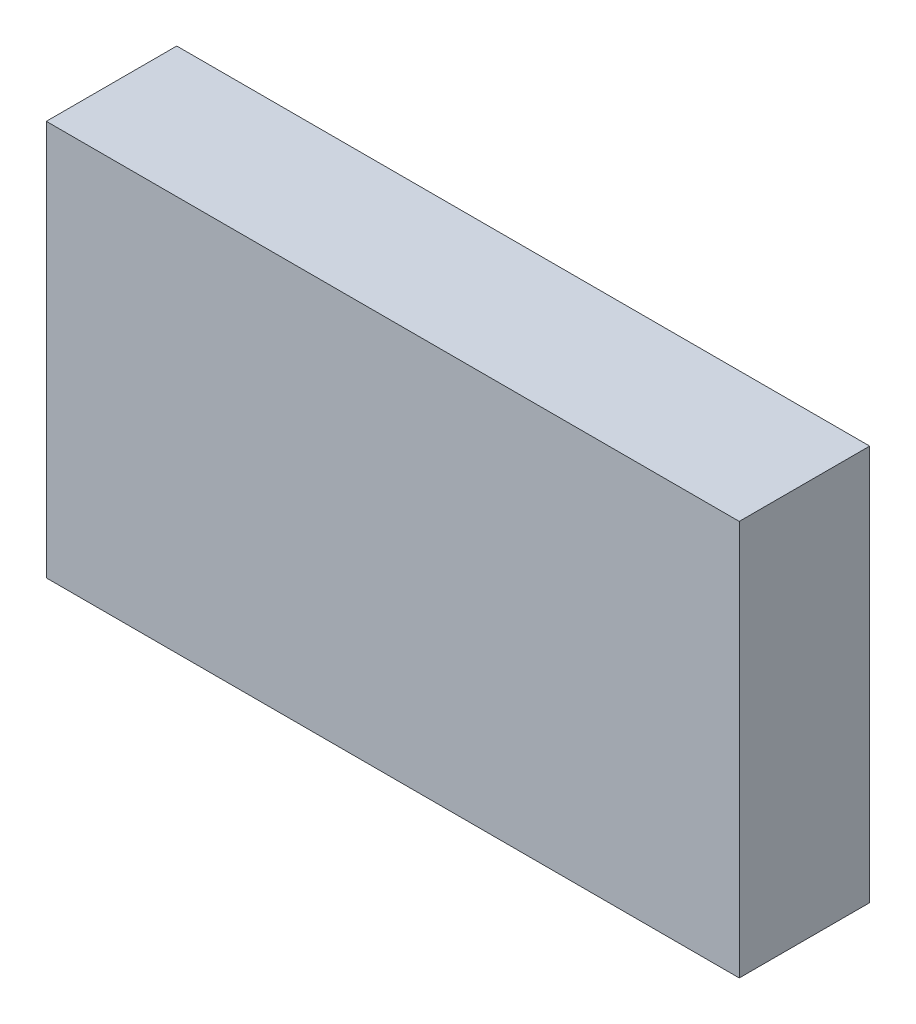
ISO-10303-21;
HEADER;
FILE_DESCRIPTION(('STEP AP214'),'2;1');
FILE_NAME('part.step','',(''),(''),'','','');
FILE_SCHEMA(('AUTOMOTIVE_DESIGN { 1 0 10303 214 1 1 1 1 }'));
ENDSEC;
DATA;
#1=APPLICATION_CONTEXT('core data for automotive mechanical design processes');
#2=APPLICATION_PROTOCOL_DEFINITION('international standard','automotive_design',2000,#1);
#3=PRODUCT_CONTEXT('',#1,'mechanical');
#4=PRODUCT('Part','Part','',(#3));
#5=PRODUCT_RELATED_PRODUCT_CATEGORY('part','',(#4));
#6=PRODUCT_DEFINITION_FORMATION('','',#4);
#7=PRODUCT_DEFINITION_CONTEXT('part definition',#1,'design');
#8=PRODUCT_DEFINITION('design','',#6,#7);
#9=PRODUCT_DEFINITION_SHAPE('','',#8);
#10=(LENGTH_UNIT() NAMED_UNIT(*) SI_UNIT(.MILLI.,.METRE.));
#11=(NAMED_UNIT(*) PLANE_ANGLE_UNIT() SI_UNIT($,.RADIAN.));
#12=(NAMED_UNIT(*) SI_UNIT($,.STERADIAN.) SOLID_ANGLE_UNIT());
#13=UNCERTAINTY_MEASURE_WITH_UNIT(LENGTH_MEASURE(1.E-05),#10,'distance_accuracy_value','');
#14=(GEOMETRIC_REPRESENTATION_CONTEXT(3) GLOBAL_UNCERTAINTY_ASSIGNED_CONTEXT((#13)) GLOBAL_UNIT_ASSIGNED_CONTEXT((#10,
#11,#12)) REPRESENTATION_CONTEXT('',''));
#15=CARTESIAN_POINT('',(0.,0.,0.));
#16=DIRECTION('',(0.,0.,1.));
#17=DIRECTION('',(1.,0.,0.));
#18=AXIS2_PLACEMENT_3D('',#15,#16,#17);
#19=CARTESIAN_POINT('',(-54.5683161798166,42.0089418209699,20.));
#20=DIRECTION('',(1.,0.,0.));
#21=DIRECTION('',(0.,0.,-1.));
#22=AXIS2_PLACEMENT_3D('',#19,#20,#21);
#23=PLANE('',#22);
#24=DIRECTION('',(0.,-1.,0.));
#25=VECTOR('',#24,1.);
#26=CARTESIAN_POINT('',(-54.5683161798166,42.0089418209699,0.));
#27=LINE('',#26,#25);
#28=CARTESIAN_POINT('',(-54.5683161798166,42.0089418209699,0.));
#29=VERTEX_POINT('',#28);
#30=CARTESIAN_POINT('',(-54.5683161798166,-18.6225206010485,0.));
#31=VERTEX_POINT('',#30);
#32=EDGE_CURVE('E96',#29,#31,#27,.T.);
#33=ORIENTED_EDGE('',*,*,#32,.T.);
#34=DIRECTION('',(0.,0.,-1.));
#35=VECTOR('',#34,1.);
#36=CARTESIAN_POINT('',(-54.5683161798166,-18.6225206010485,20.));
#37=LINE('',#36,#35);
#38=CARTESIAN_POINT('',(-54.5683161798166,-18.6225206010485,20.));
#39=VERTEX_POINT('',#38);
#40=EDGE_CURVE('E11',#39,#31,#37,.T.);
#41=ORIENTED_EDGE('',*,*,#40,.F.);
#42=DIRECTION('',(0.,-1.,0.));
#43=VECTOR('',#42,1.);
#44=CARTESIAN_POINT('',(-54.5683161798166,42.0089418209699,20.));
#45=LINE('',#44,#43);
#46=CARTESIAN_POINT('',(-54.5683161798166,42.0089418209699,20.));
#47=VERTEX_POINT('',#46);
#48=EDGE_CURVE('E84',#47,#39,#45,.T.);
#49=ORIENTED_EDGE('',*,*,#48,.F.);
#50=DIRECTION('',(0.,0.,-1.));
#51=VECTOR('',#50,1.);
#52=CARTESIAN_POINT('',(-54.5683161798166,42.0089418209699,20.));
#53=LINE('',#52,#51);
#54=EDGE_CURVE('E92',#47,#29,#53,.T.);
#55=ORIENTED_EDGE('',*,*,#54,.T.);
#56=EDGE_LOOP('',(#33,#41,#49,#55));
#57=FACE_BOUND('',#56,.T.);
#58=ADVANCED_FACE('F33',(#57),#23,.F.);
#59=CARTESIAN_POINT('',(-54.5683161798166,-18.6225206010485,20.));
#60=DIRECTION('',(0.,1.,0.));
#61=DIRECTION('',(0.,0.,1.));
#62=AXIS2_PLACEMENT_3D('',#59,#60,#61);
#63=PLANE('',#62);
#64=DIRECTION('',(1.,0.,0.));
#65=VECTOR('',#64,1.);
#66=CARTESIAN_POINT('',(-54.5683161798166,-18.6225206010485,0.));
#67=LINE('',#66,#65);
#68=CARTESIAN_POINT('',(51.68110368353,-18.6225206010485,0.));
#69=VERTEX_POINT('',#68);
#70=EDGE_CURVE('E88',#31,#69,#67,.T.);
#71=ORIENTED_EDGE('',*,*,#70,.T.);
#72=DIRECTION('',(0.,0.,-1.));
#73=VECTOR('',#72,1.);
#74=CARTESIAN_POINT('',(51.68110368353,-18.6225206010485,20.));
#75=LINE('',#74,#73);
#76=CARTESIAN_POINT('',(51.68110368353,-18.6225206010485,20.));
#77=VERTEX_POINT('',#76);
#78=EDGE_CURVE('E41',#77,#69,#75,.T.);
#79=ORIENTED_EDGE('',*,*,#78,.F.);
#80=DIRECTION('',(1.,0.,0.));
#81=VECTOR('',#80,1.);
#82=CARTESIAN_POINT('',(-54.5683161798166,-18.6225206010485,20.));
#83=LINE('',#82,#81);
#84=EDGE_CURVE('E79',#39,#77,#83,.T.);
#85=ORIENTED_EDGE('',*,*,#84,.F.);
#86=ORIENTED_EDGE('',*,*,#40,.T.);
#87=EDGE_LOOP('',(#71,#79,#85,#86));
#88=FACE_BOUND('',#87,.T.);
#89=ADVANCED_FACE('F87',(#88),#63,.F.);
#90=CARTESIAN_POINT('',(51.68110368353,42.0089418209699,20.));
#91=DIRECTION('',(-1.,0.,0.));
#92=DIRECTION('',(0.,0.,1.));
#93=AXIS2_PLACEMENT_3D('',#90,#91,#92);
#94=PLANE('',#93);
#95=DIRECTION('',(0.,1.,0.));
#96=VECTOR('',#95,1.);
#97=CARTESIAN_POINT('',(51.68110368353,42.0089418209699,0.));
#98=LINE('',#97,#96);
#99=CARTESIAN_POINT('',(51.68110368353,42.0089418209699,0.));
#100=VERTEX_POINT('',#99);
#101=EDGE_CURVE('E66',#69,#100,#98,.T.);
#102=ORIENTED_EDGE('',*,*,#101,.T.);
#103=DIRECTION('',(0.,0.,-1.));
#104=VECTOR('',#103,1.);
#105=CARTESIAN_POINT('',(51.68110368353,42.0089418209699,20.));
#106=LINE('',#105,#104);
#107=CARTESIAN_POINT('',(51.68110368353,42.0089418209699,20.));
#108=VERTEX_POINT('',#107);
#109=EDGE_CURVE('E89',#108,#100,#106,.T.);
#110=ORIENTED_EDGE('',*,*,#109,.F.);
#111=DIRECTION('',(0.,1.,0.));
#112=VECTOR('',#111,1.);
#113=CARTESIAN_POINT('',(51.68110368353,42.0089418209699,20.));
#114=LINE('',#113,#112);
#115=EDGE_CURVE('E82',#77,#108,#114,.T.);
#116=ORIENTED_EDGE('',*,*,#115,.F.);
#117=ORIENTED_EDGE('',*,*,#78,.T.);
#118=EDGE_LOOP('',(#102,#110,#116,#117));
#119=FACE_BOUND('',#118,.T.);
#120=ADVANCED_FACE('F90',(#119),#94,.F.);
#121=CARTESIAN_POINT('',(-54.5683161798166,42.0089418209699,20.));
#122=DIRECTION('',(0.,-1.,0.));
#123=DIRECTION('',(0.,0.,-1.));
#124=AXIS2_PLACEMENT_3D('',#121,#122,#123);
#125=PLANE('',#124);
#126=DIRECTION('',(-1.,0.,0.));
#127=VECTOR('',#126,1.);
#128=CARTESIAN_POINT('',(-54.5683161798166,42.0089418209699,0.));
#129=LINE('',#128,#127);
#130=EDGE_CURVE('E72',#100,#29,#129,.T.);
#131=ORIENTED_EDGE('',*,*,#130,.T.);
#132=ORIENTED_EDGE('',*,*,#54,.F.);
#133=DIRECTION('',(-1.,0.,0.));
#134=VECTOR('',#133,1.);
#135=CARTESIAN_POINT('',(-54.5683161798166,42.0089418209699,20.));
#136=LINE('',#135,#134);
#137=EDGE_CURVE('E49',#108,#47,#136,.T.);
#138=ORIENTED_EDGE('',*,*,#137,.F.);
#139=ORIENTED_EDGE('',*,*,#109,.T.);
#140=EDGE_LOOP('',(#131,#132,#138,#139));
#141=FACE_BOUND('',#140,.T.);
#142=ADVANCED_FACE('F103',(#141),#125,.F.);
#143=CARTESIAN_POINT('',(0.,0.,20.));
#144=DIRECTION('',(0.,0.,1.));
#145=DIRECTION('',(1.,0.,0.));
#146=AXIS2_PLACEMENT_3D('',#143,#144,#145);
#147=PLANE('',#146);
#148=ORIENTED_EDGE('',*,*,#48,.T.);
#149=ORIENTED_EDGE('',*,*,#84,.T.);
#150=ORIENTED_EDGE('',*,*,#115,.T.);
#151=ORIENTED_EDGE('',*,*,#137,.T.);
#152=EDGE_LOOP('',(#148,#149,#150,#151));
#153=FACE_BOUND('',#152,.T.);
#154=ADVANCED_FACE('F80',(#153),#147,.T.);
#155=CARTESIAN_POINT('',(0.,0.,0.));
#156=DIRECTION('',(0.,0.,1.));
#157=DIRECTION('',(1.,0.,0.));
#158=AXIS2_PLACEMENT_3D('',#155,#156,#157);
#159=PLANE('',#158);
#160=ORIENTED_EDGE('',*,*,#32,.F.);
#161=ORIENTED_EDGE('',*,*,#130,.F.);
#162=ORIENTED_EDGE('',*,*,#101,.F.);
#163=ORIENTED_EDGE('',*,*,#70,.F.);
#164=EDGE_LOOP('',(#160,#161,#162,#163));
#165=FACE_BOUND('',#164,.T.);
#166=ADVANCED_FACE('F106',(#165),#159,.F.);
#167=CLOSED_SHELL('',(#58,#89,#120,#142,#154,#166));
#168=MANIFOLD_SOLID_BREP('B2',#167);
#169=ADVANCED_BREP_SHAPE_REPRESENTATION('',(#18,#168),#14);
#170=SHAPE_DEFINITION_REPRESENTATION(#9,#169);
ENDSEC;
END-ISO-10303-21;
